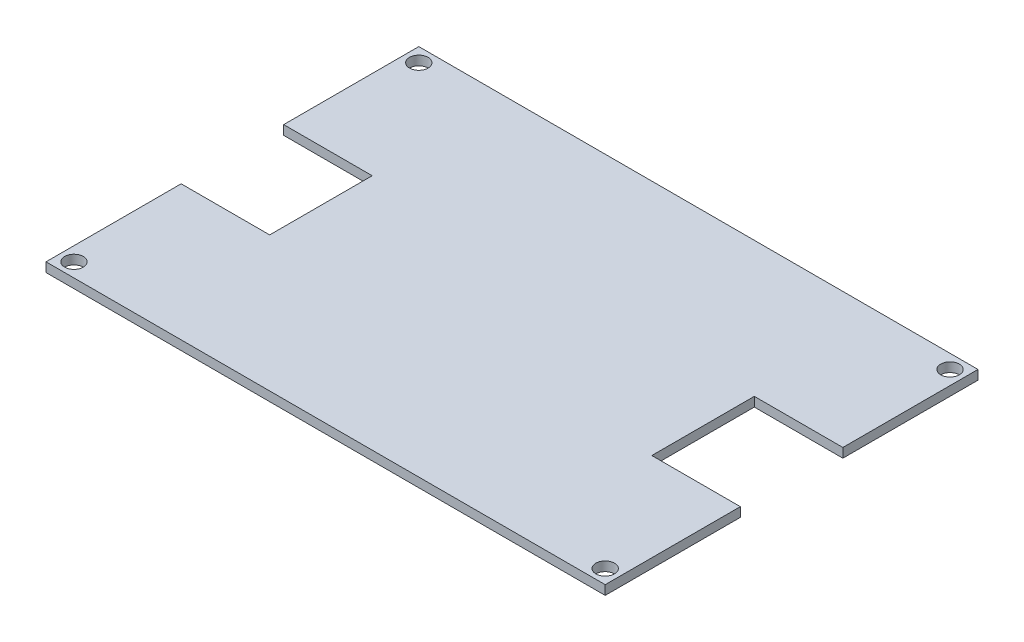
ISO-10303-21;
HEADER;
FILE_DESCRIPTION(('STEP AP214'),'2;1');
FILE_NAME('part.step','',(''),(''),'','','');
FILE_SCHEMA(('AUTOMOTIVE_DESIGN { 1 0 10303 214 1 1 1 1 }'));
ENDSEC;
DATA;
#1=APPLICATION_CONTEXT('core data for automotive mechanical design processes');
#2=APPLICATION_PROTOCOL_DEFINITION('international standard','automotive_design',2000,#1);
#3=PRODUCT_CONTEXT('',#1,'mechanical');
#4=PRODUCT('Part','Part','',(#3));
#5=PRODUCT_RELATED_PRODUCT_CATEGORY('part','',(#4));
#6=PRODUCT_DEFINITION_FORMATION('','',#4);
#7=PRODUCT_DEFINITION_CONTEXT('part definition',#1,'design');
#8=PRODUCT_DEFINITION('design','',#6,#7);
#9=PRODUCT_DEFINITION_SHAPE('','',#8);
#10=(LENGTH_UNIT() NAMED_UNIT(*) SI_UNIT(.MILLI.,.METRE.));
#11=(NAMED_UNIT(*) PLANE_ANGLE_UNIT() SI_UNIT($,.RADIAN.));
#12=(NAMED_UNIT(*) SI_UNIT($,.STERADIAN.) SOLID_ANGLE_UNIT());
#13=UNCERTAINTY_MEASURE_WITH_UNIT(LENGTH_MEASURE(1.E-05),#10,'distance_accuracy_value','');
#14=(GEOMETRIC_REPRESENTATION_CONTEXT(3) GLOBAL_UNCERTAINTY_ASSIGNED_CONTEXT((#13)) GLOBAL_UNIT_ASSIGNED_CONTEXT((#10,
#11,#12)) REPRESENTATION_CONTEXT('',''));
#15=CARTESIAN_POINT('',(0.,0.,0.));
#16=DIRECTION('',(0.,0.,1.));
#17=DIRECTION('',(1.,0.,0.));
#18=AXIS2_PLACEMENT_3D('',#15,#16,#17);
#19=CARTESIAN_POINT('',(60.,2.,40.));
#20=DIRECTION('',(-1.,0.,0.));
#21=DIRECTION('',(0.,0.,1.));
#22=AXIS2_PLACEMENT_3D('',#19,#20,#21);
#23=PLANE('',#22);
#24=DIRECTION('',(0.,-1.,0.));
#25=VECTOR('',#24,1.);
#26=CARTESIAN_POINT('',(60.,22.,-11.));
#27=LINE('',#26,#25);
#28=CARTESIAN_POINT('',(60.,2.,-11.));
#29=VERTEX_POINT('',#28);
#30=CARTESIAN_POINT('',(60.,0.,-11.));
#31=VERTEX_POINT('',#30);
#32=EDGE_CURVE('E154',#29,#31,#27,.T.);
#33=ORIENTED_EDGE('',*,*,#32,.T.);
#34=DIRECTION('',(0.,0.,-1.));
#35=VECTOR('',#34,1.);
#36=CARTESIAN_POINT('',(60.,0.,40.));
#37=LINE('',#36,#35);
#38=CARTESIAN_POINT('',(60.,0.,-40.));
#39=VERTEX_POINT('',#38);
#40=EDGE_CURVE('E188',#31,#39,#37,.T.);
#41=ORIENTED_EDGE('',*,*,#40,.T.);
#42=DIRECTION('',(0.,-1.,0.));
#43=VECTOR('',#42,1.);
#44=CARTESIAN_POINT('',(60.,2.,-40.));
#45=LINE('',#44,#43);
#46=CARTESIAN_POINT('',(60.,2.,-40.));
#47=VERTEX_POINT('',#46);
#48=EDGE_CURVE('E230',#47,#39,#45,.T.);
#49=ORIENTED_EDGE('',*,*,#48,.F.);
#50=DIRECTION('',(0.,0.,-1.));
#51=VECTOR('',#50,1.);
#52=CARTESIAN_POINT('',(60.,2.,40.));
#53=LINE('',#52,#51);
#54=EDGE_CURVE('E192',#29,#47,#53,.T.);
#55=ORIENTED_EDGE('',*,*,#54,.F.);
#56=EDGE_LOOP('',(#33,#41,#49,#55));
#57=FACE_BOUND('',#56,.T.);
#58=ADVANCED_FACE('F39',(#57),#23,.F.);
#59=DIRECTION('',(0.,-1.,0.));
#60=VECTOR('',#59,1.);
#61=CARTESIAN_POINT('',(60.,22.,11.));
#62=LINE('',#61,#60);
#63=CARTESIAN_POINT('',(60.,2.,11.));
#64=VERTEX_POINT('',#63);
#65=CARTESIAN_POINT('',(60.,0.,11.));
#66=VERTEX_POINT('',#65);
#67=EDGE_CURVE('E56',#64,#66,#62,.T.);
#68=ORIENTED_EDGE('',*,*,#67,.F.);
#69=CARTESIAN_POINT('',(60.,2.,40.));
#70=VERTEX_POINT('',#69);
#71=EDGE_CURVE('E152',#70,#64,#53,.T.);
#72=ORIENTED_EDGE('',*,*,#71,.F.);
#73=DIRECTION('',(0.,-1.,0.));
#74=VECTOR('',#73,1.);
#75=CARTESIAN_POINT('',(60.,2.,40.));
#76=LINE('',#75,#74);
#77=CARTESIAN_POINT('',(60.,0.,40.));
#78=VERTEX_POINT('',#77);
#79=EDGE_CURVE('E203',#70,#78,#76,.T.);
#80=ORIENTED_EDGE('',*,*,#79,.T.);
#81=EDGE_CURVE('E204',#78,#66,#37,.T.);
#82=ORIENTED_EDGE('',*,*,#81,.T.);
#83=EDGE_LOOP('',(#68,#72,#80,#82));
#84=FACE_BOUND('',#83,.T.);
#85=ADVANCED_FACE('F303',(#84),#23,.F.);
#86=CARTESIAN_POINT('',(0.,2.,0.));
#87=DIRECTION('',(0.,-1.,0.));
#88=DIRECTION('',(0.,0.,-1.));
#89=AXIS2_PLACEMENT_3D('',#86,#87,#88);
#90=PLANE('',#89);
#91=CARTESIAN_POINT('',(-57.,2.,37.));
#92=DIRECTION('',(0.,-1.,0.));
#93=DIRECTION('',(0.,0.,-1.));
#94=AXIS2_PLACEMENT_3D('',#91,#92,#93);
#95=CIRCLE('',#94,2.);
#96=CARTESIAN_POINT('',(-57.,2.,35.));
#97=VERTEX_POINT('',#96);
#98=EDGE_CURVE('E272',#97,#97,#95,.F.);
#99=ORIENTED_EDGE('',*,*,#98,.F.);
#100=EDGE_LOOP('',(#99));
#101=FACE_BOUND('',#100,.T.);
#102=CARTESIAN_POINT('',(57.,2.,37.));
#103=DIRECTION('',(0.,-1.,0.));
#104=DIRECTION('',(0.,0.,-1.));
#105=AXIS2_PLACEMENT_3D('',#102,#103,#104);
#106=CIRCLE('',#105,2.);
#107=CARTESIAN_POINT('',(57.,2.,35.));
#108=VERTEX_POINT('',#107);
#109=EDGE_CURVE('E259',#108,#108,#106,.F.);
#110=ORIENTED_EDGE('',*,*,#109,.F.);
#111=EDGE_LOOP('',(#110));
#112=FACE_BOUND('',#111,.T.);
#113=CARTESIAN_POINT('',(57.,2.,-37.));
#114=DIRECTION('',(0.,-1.,0.));
#115=DIRECTION('',(0.,0.,-1.));
#116=AXIS2_PLACEMENT_3D('',#113,#114,#115);
#117=CIRCLE('',#116,2.);
#118=CARTESIAN_POINT('',(57.,2.,-39.));
#119=VERTEX_POINT('',#118);
#120=EDGE_CURVE('E255',#119,#119,#117,.F.);
#121=ORIENTED_EDGE('',*,*,#120,.F.);
#122=EDGE_LOOP('',(#121));
#123=FACE_BOUND('',#122,.T.);
#124=CARTESIAN_POINT('',(-57.,2.,-37.));
#125=DIRECTION('',(0.,-1.,0.));
#126=DIRECTION('',(0.,0.,-1.));
#127=AXIS2_PLACEMENT_3D('',#124,#125,#126);
#128=CIRCLE('',#127,2.);
#129=CARTESIAN_POINT('',(-57.,2.,-39.));
#130=VERTEX_POINT('',#129);
#131=EDGE_CURVE('E251',#130,#130,#128,.F.);
#132=ORIENTED_EDGE('',*,*,#131,.F.);
#133=EDGE_LOOP('',(#132));
#134=FACE_BOUND('',#133,.T.);
#135=DIRECTION('',(-1.,0.,0.));
#136=VECTOR('',#135,1.);
#137=CARTESIAN_POINT('',(0.,2.,-11.));
#138=LINE('',#137,#136);
#139=CARTESIAN_POINT('',(41.,2.,-11.));
#140=VERTEX_POINT('',#139);
#141=EDGE_CURVE('E142',#29,#140,#138,.T.);
#142=ORIENTED_EDGE('',*,*,#141,.F.);
#143=ORIENTED_EDGE('',*,*,#54,.T.);
#144=DIRECTION('',(-1.,0.,0.));
#145=VECTOR('',#144,1.);
#146=CARTESIAN_POINT('',(-60.,2.,-40.));
#147=LINE('',#146,#145);
#148=CARTESIAN_POINT('',(-60.,2.,-40.));
#149=VERTEX_POINT('',#148);
#150=EDGE_CURVE('E191',#47,#149,#147,.T.);
#151=ORIENTED_EDGE('',*,*,#150,.T.);
#152=DIRECTION('',(0.,0.,1.));
#153=VECTOR('',#152,1.);
#154=CARTESIAN_POINT('',(-60.,2.,40.));
#155=LINE('',#154,#153);
#156=CARTESIAN_POINT('',(-60.,2.,-11.));
#157=VERTEX_POINT('',#156);
#158=EDGE_CURVE('E196',#149,#157,#155,.T.);
#159=ORIENTED_EDGE('',*,*,#158,.T.);
#160=DIRECTION('',(1.,0.,0.));
#161=VECTOR('',#160,1.);
#162=CARTESIAN_POINT('',(0.,2.,-11.));
#163=LINE('',#162,#161);
#164=CARTESIAN_POINT('',(-41.,2.,-11.));
#165=VERTEX_POINT('',#164);
#166=EDGE_CURVE('E184',#157,#165,#163,.T.);
#167=ORIENTED_EDGE('',*,*,#166,.T.);
#168=DIRECTION('',(0.,0.,1.));
#169=VECTOR('',#168,1.);
#170=CARTESIAN_POINT('',(-41.,2.,0.));
#171=LINE('',#170,#169);
#172=CARTESIAN_POINT('',(-41.,2.,11.));
#173=VERTEX_POINT('',#172);
#174=EDGE_CURVE('E166',#165,#173,#171,.T.);
#175=ORIENTED_EDGE('',*,*,#174,.T.);
#176=DIRECTION('',(-1.,0.,0.));
#177=VECTOR('',#176,1.);
#178=CARTESIAN_POINT('',(0.,2.,11.));
#179=LINE('',#178,#177);
#180=CARTESIAN_POINT('',(-60.,2.,11.));
#181=VERTEX_POINT('',#180);
#182=EDGE_CURVE('E180',#173,#181,#179,.T.);
#183=ORIENTED_EDGE('',*,*,#182,.T.);
#184=CARTESIAN_POINT('',(-60.,2.,40.));
#185=VERTEX_POINT('',#184);
#186=EDGE_CURVE('E195',#181,#185,#155,.T.);
#187=ORIENTED_EDGE('',*,*,#186,.T.);
#188=DIRECTION('',(1.,0.,0.));
#189=VECTOR('',#188,1.);
#190=CARTESIAN_POINT('',(-60.,2.,40.));
#191=LINE('',#190,#189);
#192=EDGE_CURVE('E200',#185,#70,#191,.T.);
#193=ORIENTED_EDGE('',*,*,#192,.T.);
#194=ORIENTED_EDGE('',*,*,#71,.T.);
#195=DIRECTION('',(1.,0.,0.));
#196=VECTOR('',#195,1.);
#197=CARTESIAN_POINT('',(0.,2.,11.));
#198=LINE('',#197,#196);
#199=CARTESIAN_POINT('',(41.,2.,11.));
#200=VERTEX_POINT('',#199);
#201=EDGE_CURVE('E143',#200,#64,#198,.T.);
#202=ORIENTED_EDGE('',*,*,#201,.F.);
#203=DIRECTION('',(0.,0.,1.));
#204=VECTOR('',#203,1.);
#205=CARTESIAN_POINT('',(41.,2.,0.));
#206=LINE('',#205,#204);
#207=EDGE_CURVE('E131',#140,#200,#206,.T.);
#208=ORIENTED_EDGE('',*,*,#207,.F.);
#209=EDGE_LOOP('',(#142,#143,#151,#159,#167,#175,#183,#187,#193,#194,#202,#208));
#210=FACE_BOUND('',#209,.T.);
#211=ADVANCED_FACE('F150',(#101,#112,#123,#134,#210),#90,.F.);
#212=CARTESIAN_POINT('',(0.,0.,0.));
#213=DIRECTION('',(0.,-1.,0.));
#214=DIRECTION('',(0.,0.,-1.));
#215=AXIS2_PLACEMENT_3D('',#212,#213,#214);
#216=PLANE('',#215);
#217=CARTESIAN_POINT('',(-57.,0.,37.));
#218=DIRECTION('',(0.,-1.,0.));
#219=DIRECTION('',(0.,0.,-1.));
#220=AXIS2_PLACEMENT_3D('',#217,#218,#219);
#221=CIRCLE('',#220,2.);
#222=CARTESIAN_POINT('',(-57.,0.,35.));
#223=VERTEX_POINT('',#222);
#224=EDGE_CURVE('E42',#223,#223,#221,.F.);
#225=ORIENTED_EDGE('',*,*,#224,.T.);
#226=EDGE_LOOP('',(#225));
#227=FACE_BOUND('',#226,.T.);
#228=CARTESIAN_POINT('',(57.,0.,37.));
#229=DIRECTION('',(0.,-1.,0.));
#230=DIRECTION('',(0.,0.,-1.));
#231=AXIS2_PLACEMENT_3D('',#228,#229,#230);
#232=CIRCLE('',#231,2.);
#233=CARTESIAN_POINT('',(57.,0.,35.));
#234=VERTEX_POINT('',#233);
#235=EDGE_CURVE('E256',#234,#234,#232,.F.);
#236=ORIENTED_EDGE('',*,*,#235,.T.);
#237=EDGE_LOOP('',(#236));
#238=FACE_BOUND('',#237,.T.);
#239=CARTESIAN_POINT('',(57.,0.,-37.));
#240=DIRECTION('',(0.,-1.,0.));
#241=DIRECTION('',(0.,0.,-1.));
#242=AXIS2_PLACEMENT_3D('',#239,#240,#241);
#243=CIRCLE('',#242,2.);
#244=CARTESIAN_POINT('',(57.,0.,-39.));
#245=VERTEX_POINT('',#244);
#246=EDGE_CURVE('E252',#245,#245,#243,.F.);
#247=ORIENTED_EDGE('',*,*,#246,.T.);
#248=EDGE_LOOP('',(#247));
#249=FACE_BOUND('',#248,.T.);
#250=CARTESIAN_POINT('',(-57.,0.,-37.));
#251=DIRECTION('',(0.,-1.,0.));
#252=DIRECTION('',(0.,0.,-1.));
#253=AXIS2_PLACEMENT_3D('',#250,#251,#252);
#254=CIRCLE('',#253,2.);
#255=CARTESIAN_POINT('',(-57.,0.,-39.));
#256=VERTEX_POINT('',#255);
#257=EDGE_CURVE('E247',#256,#256,#254,.F.);
#258=ORIENTED_EDGE('',*,*,#257,.T.);
#259=EDGE_LOOP('',(#258));
#260=FACE_BOUND('',#259,.T.);
#261=ORIENTED_EDGE('',*,*,#40,.F.);
#262=DIRECTION('',(-1.,0.,0.));
#263=VECTOR('',#262,1.);
#264=CARTESIAN_POINT('',(0.,0.,-11.));
#265=LINE('',#264,#263);
#266=CARTESIAN_POINT('',(41.,0.,-11.));
#267=VERTEX_POINT('',#266);
#268=EDGE_CURVE('E11',#31,#267,#265,.T.);
#269=ORIENTED_EDGE('',*,*,#268,.T.);
#270=DIRECTION('',(0.,0.,1.));
#271=VECTOR('',#270,1.);
#272=CARTESIAN_POINT('',(41.,0.,0.));
#273=LINE('',#272,#271);
#274=CARTESIAN_POINT('',(41.,0.,11.));
#275=VERTEX_POINT('',#274);
#276=EDGE_CURVE('E48',#267,#275,#273,.T.);
#277=ORIENTED_EDGE('',*,*,#276,.T.);
#278=DIRECTION('',(1.,0.,0.));
#279=VECTOR('',#278,1.);
#280=CARTESIAN_POINT('',(0.,0.,11.));
#281=LINE('',#280,#279);
#282=EDGE_CURVE('E146',#275,#66,#281,.T.);
#283=ORIENTED_EDGE('',*,*,#282,.T.);
#284=ORIENTED_EDGE('',*,*,#81,.F.);
#285=DIRECTION('',(1.,0.,0.));
#286=VECTOR('',#285,1.);
#287=CARTESIAN_POINT('',(-60.,0.,40.));
#288=LINE('',#287,#286);
#289=CARTESIAN_POINT('',(-60.,0.,40.));
#290=VERTEX_POINT('',#289);
#291=EDGE_CURVE('E216',#290,#78,#288,.T.);
#292=ORIENTED_EDGE('',*,*,#291,.F.);
#293=DIRECTION('',(0.,0.,1.));
#294=VECTOR('',#293,1.);
#295=CARTESIAN_POINT('',(-60.,0.,40.));
#296=LINE('',#295,#294);
#297=CARTESIAN_POINT('',(-60.,0.,11.));
#298=VERTEX_POINT('',#297);
#299=EDGE_CURVE('E211',#298,#290,#296,.T.);
#300=ORIENTED_EDGE('',*,*,#299,.F.);
#301=DIRECTION('',(-1.,0.,0.));
#302=VECTOR('',#301,1.);
#303=CARTESIAN_POINT('',(0.,0.,11.));
#304=LINE('',#303,#302);
#305=CARTESIAN_POINT('',(-41.,0.,11.));
#306=VERTEX_POINT('',#305);
#307=EDGE_CURVE('E237',#306,#298,#304,.T.);
#308=ORIENTED_EDGE('',*,*,#307,.F.);
#309=DIRECTION('',(0.,0.,1.));
#310=VECTOR('',#309,1.);
#311=CARTESIAN_POINT('',(-41.,0.,0.));
#312=LINE('',#311,#310);
#313=CARTESIAN_POINT('',(-41.,0.,-11.));
#314=VERTEX_POINT('',#313);
#315=EDGE_CURVE('E234',#314,#306,#312,.T.);
#316=ORIENTED_EDGE('',*,*,#315,.F.);
#317=DIRECTION('',(1.,0.,0.));
#318=VECTOR('',#317,1.);
#319=CARTESIAN_POINT('',(0.,0.,-11.));
#320=LINE('',#319,#318);
#321=CARTESIAN_POINT('',(-60.,0.,-11.));
#322=VERTEX_POINT('',#321);
#323=EDGE_CURVE('E240',#322,#314,#320,.T.);
#324=ORIENTED_EDGE('',*,*,#323,.F.);
#325=CARTESIAN_POINT('',(-60.,0.,-40.));
#326=VERTEX_POINT('',#325);
#327=EDGE_CURVE('E212',#326,#322,#296,.T.);
#328=ORIENTED_EDGE('',*,*,#327,.F.);
#329=DIRECTION('',(-1.,0.,0.));
#330=VECTOR('',#329,1.);
#331=CARTESIAN_POINT('',(-60.,0.,-40.));
#332=LINE('',#331,#330);
#333=EDGE_CURVE('E208',#39,#326,#332,.T.);
#334=ORIENTED_EDGE('',*,*,#333,.F.);
#335=EDGE_LOOP('',(#261,#269,#277,#283,#284,#292,#300,#308,#316,#324,#328,#334));
#336=FACE_BOUND('',#335,.T.);
#337=ADVANCED_FACE('F282',(#227,#238,#249,#260,#336),#216,.T.);
#338=CARTESIAN_POINT('',(-60.,2.,40.));
#339=DIRECTION('',(1.,0.,0.));
#340=DIRECTION('',(0.,0.,-1.));
#341=AXIS2_PLACEMENT_3D('',#338,#339,#340);
#342=PLANE('',#341);
#343=ORIENTED_EDGE('',*,*,#327,.T.);
#344=DIRECTION('',(0.,-1.,0.));
#345=VECTOR('',#344,1.);
#346=CARTESIAN_POINT('',(-60.,22.,-11.));
#347=LINE('',#346,#345);
#348=EDGE_CURVE('E163',#157,#322,#347,.T.);
#349=ORIENTED_EDGE('',*,*,#348,.F.);
#350=ORIENTED_EDGE('',*,*,#158,.F.);
#351=DIRECTION('',(0.,-1.,0.));
#352=VECTOR('',#351,1.);
#353=CARTESIAN_POINT('',(-60.,2.,-40.));
#354=LINE('',#353,#352);
#355=EDGE_CURVE('E226',#149,#326,#354,.T.);
#356=ORIENTED_EDGE('',*,*,#355,.T.);
#357=EDGE_LOOP('',(#343,#349,#350,#356));
#358=FACE_BOUND('',#357,.T.);
#359=ADVANCED_FACE('F316',(#358),#342,.F.);
#360=CARTESIAN_POINT('',(-60.,2.,-40.));
#361=DIRECTION('',(0.,0.,1.));
#362=DIRECTION('',(1.,0.,0.));
#363=AXIS2_PLACEMENT_3D('',#360,#361,#362);
#364=PLANE('',#363);
#365=ORIENTED_EDGE('',*,*,#333,.T.);
#366=ORIENTED_EDGE('',*,*,#355,.F.);
#367=ORIENTED_EDGE('',*,*,#150,.F.);
#368=ORIENTED_EDGE('',*,*,#48,.T.);
#369=EDGE_LOOP('',(#365,#366,#367,#368));
#370=FACE_BOUND('',#369,.T.);
#371=ADVANCED_FACE('F320',(#370),#364,.F.);
#372=ORIENTED_EDGE('',*,*,#186,.F.);
#373=DIRECTION('',(0.,-1.,0.));
#374=VECTOR('',#373,1.);
#375=CARTESIAN_POINT('',(-60.,22.,11.));
#376=LINE('',#375,#374);
#377=EDGE_CURVE('E167',#181,#298,#376,.T.);
#378=ORIENTED_EDGE('',*,*,#377,.T.);
#379=ORIENTED_EDGE('',*,*,#299,.T.);
#380=DIRECTION('',(0.,-1.,0.));
#381=VECTOR('',#380,1.);
#382=CARTESIAN_POINT('',(-60.,2.,40.));
#383=LINE('',#382,#381);
#384=EDGE_CURVE('E222',#185,#290,#383,.T.);
#385=ORIENTED_EDGE('',*,*,#384,.F.);
#386=EDGE_LOOP('',(#372,#378,#379,#385));
#387=FACE_BOUND('',#386,.T.);
#388=ADVANCED_FACE('F296',(#387),#342,.F.);
#389=CARTESIAN_POINT('',(-60.,2.,40.));
#390=DIRECTION('',(0.,0.,-1.));
#391=DIRECTION('',(-1.,0.,0.));
#392=AXIS2_PLACEMENT_3D('',#389,#390,#391);
#393=PLANE('',#392);
#394=ORIENTED_EDGE('',*,*,#291,.T.);
#395=ORIENTED_EDGE('',*,*,#79,.F.);
#396=ORIENTED_EDGE('',*,*,#192,.F.);
#397=ORIENTED_EDGE('',*,*,#384,.T.);
#398=EDGE_LOOP('',(#394,#395,#396,#397));
#399=FACE_BOUND('',#398,.T.);
#400=ADVANCED_FACE('F300',(#399),#393,.F.);
#401=CARTESIAN_POINT('',(-60.,22.,-11.));
#402=DIRECTION('',(0.,0.,-1.));
#403=DIRECTION('',(-1.,0.,0.));
#404=AXIS2_PLACEMENT_3D('',#401,#402,#403);
#405=PLANE('',#404);
#406=ORIENTED_EDGE('',*,*,#348,.T.);
#407=ORIENTED_EDGE('',*,*,#323,.T.);
#408=DIRECTION('',(0.,-1.,0.));
#409=VECTOR('',#408,1.);
#410=CARTESIAN_POINT('',(-41.,22.,-11.));
#411=LINE('',#410,#409);
#412=EDGE_CURVE('E64',#165,#314,#411,.T.);
#413=ORIENTED_EDGE('',*,*,#412,.F.);
#414=ORIENTED_EDGE('',*,*,#166,.F.);
#415=EDGE_LOOP('',(#406,#407,#413,#414));
#416=FACE_BOUND('',#415,.T.);
#417=ADVANCED_FACE('F314',(#416),#405,.F.);
#418=CARTESIAN_POINT('',(-41.,22.,11.));
#419=DIRECTION('',(0.,0.,1.));
#420=DIRECTION('',(1.,0.,0.));
#421=AXIS2_PLACEMENT_3D('',#418,#419,#420);
#422=PLANE('',#421);
#423=DIRECTION('',(0.,-1.,0.));
#424=VECTOR('',#423,1.);
#425=CARTESIAN_POINT('',(-41.,22.,11.));
#426=LINE('',#425,#424);
#427=EDGE_CURVE('E171',#173,#306,#426,.T.);
#428=ORIENTED_EDGE('',*,*,#427,.T.);
#429=ORIENTED_EDGE('',*,*,#307,.T.);
#430=ORIENTED_EDGE('',*,*,#377,.F.);
#431=ORIENTED_EDGE('',*,*,#182,.F.);
#432=EDGE_LOOP('',(#428,#429,#430,#431));
#433=FACE_BOUND('',#432,.T.);
#434=ADVANCED_FACE('F308',(#433),#422,.F.);
#435=CARTESIAN_POINT('',(-41.,22.,-11.));
#436=DIRECTION('',(1.,0.,0.));
#437=DIRECTION('',(0.,0.,-1.));
#438=AXIS2_PLACEMENT_3D('',#435,#436,#437);
#439=PLANE('',#438);
#440=ORIENTED_EDGE('',*,*,#412,.T.);
#441=ORIENTED_EDGE('',*,*,#315,.T.);
#442=ORIENTED_EDGE('',*,*,#427,.F.);
#443=ORIENTED_EDGE('',*,*,#174,.F.);
#444=EDGE_LOOP('',(#440,#441,#442,#443));
#445=FACE_BOUND('',#444,.T.);
#446=ADVANCED_FACE('F310',(#445),#439,.F.);
#447=CARTESIAN_POINT('',(41.,22.,-11.));
#448=DIRECTION('',(0.,0.,1.));
#449=DIRECTION('',(1.,0.,0.));
#450=AXIS2_PLACEMENT_3D('',#447,#448,#449);
#451=PLANE('',#450);
#452=ORIENTED_EDGE('',*,*,#141,.T.);
#453=DIRECTION('',(0.,-1.,0.));
#454=VECTOR('',#453,1.);
#455=CARTESIAN_POINT('',(41.,22.,-11.));
#456=LINE('',#455,#454);
#457=EDGE_CURVE('E137',#140,#267,#456,.T.);
#458=ORIENTED_EDGE('',*,*,#457,.T.);
#459=ORIENTED_EDGE('',*,*,#268,.F.);
#460=ORIENTED_EDGE('',*,*,#32,.F.);
#461=EDGE_LOOP('',(#452,#458,#459,#460));
#462=FACE_BOUND('',#461,.T.);
#463=ADVANCED_FACE('F279',(#462),#451,.T.);
#464=CARTESIAN_POINT('',(41.,22.,-11.));
#465=DIRECTION('',(1.,0.,0.));
#466=DIRECTION('',(0.,0.,-1.));
#467=AXIS2_PLACEMENT_3D('',#464,#465,#466);
#468=PLANE('',#467);
#469=ORIENTED_EDGE('',*,*,#207,.T.);
#470=DIRECTION('',(0.,-1.,0.));
#471=VECTOR('',#470,1.);
#472=CARTESIAN_POINT('',(41.,22.,11.));
#473=LINE('',#472,#471);
#474=EDGE_CURVE('E134',#200,#275,#473,.T.);
#475=ORIENTED_EDGE('',*,*,#474,.T.);
#476=ORIENTED_EDGE('',*,*,#276,.F.);
#477=ORIENTED_EDGE('',*,*,#457,.F.);
#478=EDGE_LOOP('',(#469,#475,#476,#477));
#479=FACE_BOUND('',#478,.T.);
#480=ADVANCED_FACE('F133',(#479),#468,.T.);
#481=CARTESIAN_POINT('',(41.,22.,11.));
#482=DIRECTION('',(0.,0.,-1.));
#483=DIRECTION('',(-1.,0.,0.));
#484=AXIS2_PLACEMENT_3D('',#481,#482,#483);
#485=PLANE('',#484);
#486=ORIENTED_EDGE('',*,*,#201,.T.);
#487=ORIENTED_EDGE('',*,*,#67,.T.);
#488=ORIENTED_EDGE('',*,*,#282,.F.);
#489=ORIENTED_EDGE('',*,*,#474,.F.);
#490=EDGE_LOOP('',(#486,#487,#488,#489));
#491=FACE_BOUND('',#490,.T.);
#492=ADVANCED_FACE('F145',(#491),#485,.T.);
#493=CARTESIAN_POINT('',(-57.,22.,-37.));
#494=DIRECTION('',(0.,-1.,0.));
#495=DIRECTION('',(0.,0.,-1.));
#496=AXIS2_PLACEMENT_3D('',#493,#494,#495);
#497=CYLINDRICAL_SURFACE('',#496,2.);
#498=ORIENTED_EDGE('',*,*,#257,.F.);
#499=EDGE_LOOP('',(#498));
#500=FACE_BOUND('',#499,.T.);
#501=ORIENTED_EDGE('',*,*,#131,.T.);
#502=EDGE_LOOP('',(#501));
#503=FACE_BOUND('',#502,.T.);
#504=ADVANCED_FACE('F365',(#500,#503),#497,.F.);
#505=CARTESIAN_POINT('',(57.,22.,-37.));
#506=DIRECTION('',(0.,-1.,0.));
#507=DIRECTION('',(0.,0.,-1.));
#508=AXIS2_PLACEMENT_3D('',#505,#506,#507);
#509=CYLINDRICAL_SURFACE('',#508,2.);
#510=ORIENTED_EDGE('',*,*,#246,.F.);
#511=EDGE_LOOP('',(#510));
#512=FACE_BOUND('',#511,.T.);
#513=ORIENTED_EDGE('',*,*,#120,.T.);
#514=EDGE_LOOP('',(#513));
#515=FACE_BOUND('',#514,.T.);
#516=ADVANCED_FACE('F370',(#512,#515),#509,.F.);
#517=CARTESIAN_POINT('',(57.,22.,37.));
#518=DIRECTION('',(0.,-1.,0.));
#519=DIRECTION('',(0.,0.,-1.));
#520=AXIS2_PLACEMENT_3D('',#517,#518,#519);
#521=CYLINDRICAL_SURFACE('',#520,2.);
#522=ORIENTED_EDGE('',*,*,#235,.F.);
#523=EDGE_LOOP('',(#522));
#524=FACE_BOUND('',#523,.T.);
#525=ORIENTED_EDGE('',*,*,#109,.T.);
#526=EDGE_LOOP('',(#525));
#527=FACE_BOUND('',#526,.T.);
#528=ADVANCED_FACE('F382',(#524,#527),#521,.F.);
#529=CARTESIAN_POINT('',(-57.,22.,37.));
#530=DIRECTION('',(0.,-1.,0.));
#531=DIRECTION('',(0.,0.,-1.));
#532=AXIS2_PLACEMENT_3D('',#529,#530,#531);
#533=CYLINDRICAL_SURFACE('',#532,2.);
#534=ORIENTED_EDGE('',*,*,#224,.F.);
#535=EDGE_LOOP('',(#534));
#536=FACE_BOUND('',#535,.T.);
#537=ORIENTED_EDGE('',*,*,#98,.T.);
#538=EDGE_LOOP('',(#537));
#539=FACE_BOUND('',#538,.T.);
#540=ADVANCED_FACE('F392',(#536,#539),#533,.F.);
#541=CLOSED_SHELL('',(#58,#85,#211,#337,#359,#371,#388,#400,#417,#434,#446,#463,#480,#492,#504,
#516,#528,#540));
#542=MANIFOLD_SOLID_BREP('B2',#541);
#543=ADVANCED_BREP_SHAPE_REPRESENTATION('',(#18,#542),#14);
#544=SHAPE_DEFINITION_REPRESENTATION(#9,#543);
ENDSEC;
END-ISO-10303-21;
